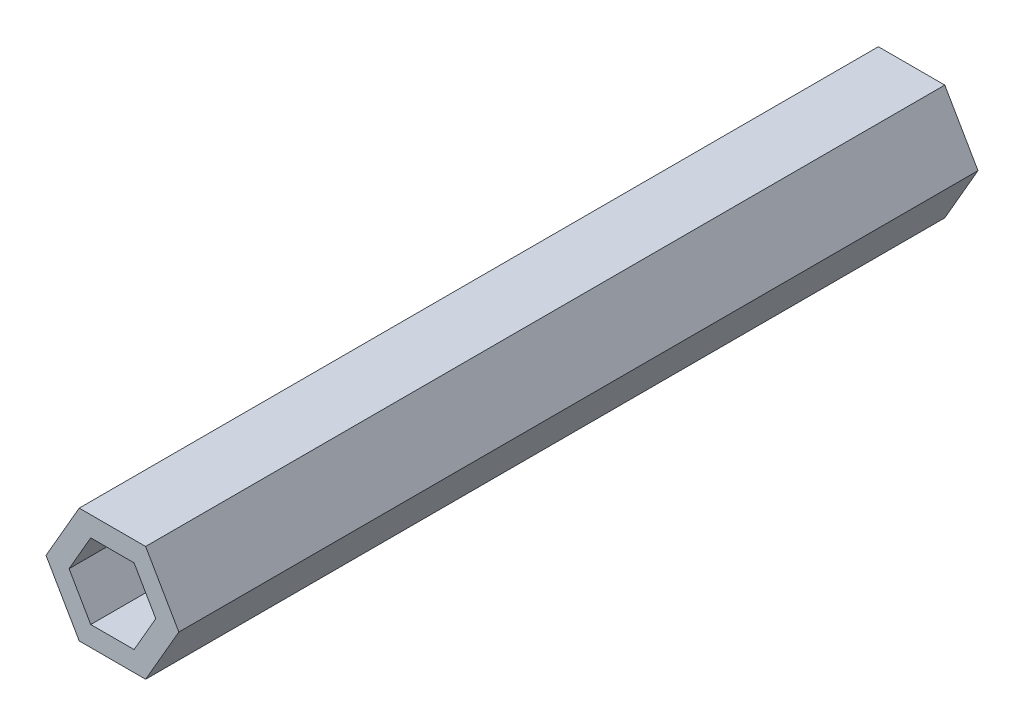
ISO-10303-21;
HEADER;
FILE_DESCRIPTION(('STEP AP214'),'2;1');
FILE_NAME('part.step','',(''),(''),'','','');
FILE_SCHEMA(('AUTOMOTIVE_DESIGN { 1 0 10303 214 1 1 1 1 }'));
ENDSEC;
DATA;
#1=APPLICATION_CONTEXT('core data for automotive mechanical design processes');
#2=APPLICATION_PROTOCOL_DEFINITION('international standard','automotive_design',2000,#1);
#3=PRODUCT_CONTEXT('',#1,'mechanical');
#4=PRODUCT('Part','Part','',(#3));
#5=PRODUCT_RELATED_PRODUCT_CATEGORY('part','',(#4));
#6=PRODUCT_DEFINITION_FORMATION('','',#4);
#7=PRODUCT_DEFINITION_CONTEXT('part definition',#1,'design');
#8=PRODUCT_DEFINITION('design','',#6,#7);
#9=PRODUCT_DEFINITION_SHAPE('','',#8);
#10=(LENGTH_UNIT() NAMED_UNIT(*) SI_UNIT(.MILLI.,.METRE.));
#11=(NAMED_UNIT(*) PLANE_ANGLE_UNIT() SI_UNIT($,.RADIAN.));
#12=(NAMED_UNIT(*) SI_UNIT($,.STERADIAN.) SOLID_ANGLE_UNIT());
#13=UNCERTAINTY_MEASURE_WITH_UNIT(LENGTH_MEASURE(1.E-05),#10,'distance_accuracy_value','');
#14=(GEOMETRIC_REPRESENTATION_CONTEXT(3) GLOBAL_UNCERTAINTY_ASSIGNED_CONTEXT((#13)) GLOBAL_UNIT_ASSIGNED_CONTEXT((#10,
#11,#12)) REPRESENTATION_CONTEXT('',''));
#15=CARTESIAN_POINT('',(0.,0.,0.));
#16=DIRECTION('',(0.,0.,1.));
#17=DIRECTION('',(1.,0.,0.));
#18=AXIS2_PLACEMENT_3D('',#15,#16,#17);
#19=CARTESIAN_POINT('',(0.,0.,101.6));
#20=DIRECTION('',(0.,0.,1.));
#21=DIRECTION('',(1.,0.,0.));
#22=AXIS2_PLACEMENT_3D('',#19,#20,#21);
#23=PLANE('',#22);
#24=DIRECTION('',(-0.5,-0.866025403784439,0.));
#25=VECTOR('',#24,1.);
#26=CARTESIAN_POINT('',(-4.22196621949221,7.31266000000002,101.6));
#27=LINE('',#26,#25);
#28=CARTESIAN_POINT('',(-4.22196621949221,7.31266000000002,101.6));
#29=VERTEX_POINT('',#28);
#30=CARTESIAN_POINT('',(-8.44393243898442,0.,101.6));
#31=VERTEX_POINT('',#30);
#32=EDGE_CURVE('E198',#29,#31,#27,.T.);
#33=ORIENTED_EDGE('',*,*,#32,.T.);
#34=DIRECTION('',(0.5,-0.866025403784439,0.));
#35=VECTOR('',#34,1.);
#36=CARTESIAN_POINT('',(-8.44393243898442,0.,101.6));
#37=LINE('',#36,#35);
#38=CARTESIAN_POINT('',(-4.22196621949221,-7.31266000000001,101.6));
#39=VERTEX_POINT('',#38);
#40=EDGE_CURVE('E202',#31,#39,#37,.T.);
#41=ORIENTED_EDGE('',*,*,#40,.T.);
#42=DIRECTION('',(1.,0.,0.));
#43=VECTOR('',#42,1.);
#44=CARTESIAN_POINT('',(-4.22196621949221,-7.31266000000001,101.6));
#45=LINE('',#44,#43);
#46=CARTESIAN_POINT('',(4.22196621949219,-7.31266000000001,101.6));
#47=VERTEX_POINT('',#46);
#48=EDGE_CURVE('E206',#39,#47,#45,.T.);
#49=ORIENTED_EDGE('',*,*,#48,.T.);
#50=DIRECTION('',(0.5,0.866025403784438,0.));
#51=VECTOR('',#50,1.);
#52=CARTESIAN_POINT('',(4.22196621949219,-7.31266000000001,101.6));
#53=LINE('',#52,#51);
#54=CARTESIAN_POINT('',(8.44393243898441,0.,101.6));
#55=VERTEX_POINT('',#54);
#56=EDGE_CURVE('E209',#47,#55,#53,.T.);
#57=ORIENTED_EDGE('',*,*,#56,.T.);
#58=DIRECTION('',(-0.5,0.866025403784439,0.));
#59=VECTOR('',#58,1.);
#60=CARTESIAN_POINT('',(8.44393243898441,0.,101.6));
#61=LINE('',#60,#59);
#62=CARTESIAN_POINT('',(4.2219662194922,7.31266000000002,101.6));
#63=VERTEX_POINT('',#62);
#64=EDGE_CURVE('E212',#55,#63,#61,.T.);
#65=ORIENTED_EDGE('',*,*,#64,.T.);
#66=DIRECTION('',(-1.,0.,0.));
#67=VECTOR('',#66,1.);
#68=CARTESIAN_POINT('',(4.2219662194922,7.31266000000002,101.6));
#69=LINE('',#68,#67);
#70=EDGE_CURVE('E215',#63,#29,#69,.T.);
#71=ORIENTED_EDGE('',*,*,#70,.T.);
#72=EDGE_LOOP('',(#33,#41,#49,#57,#65,#71));
#73=FACE_BOUND('',#72,.T.);
#74=DIRECTION('',(0.5,-0.866025403784439,0.));
#75=VECTOR('',#74,1.);
#76=CARTESIAN_POINT('',(-5.51099307150112,0.,101.6));
#77=LINE('',#76,#75);
#78=CARTESIAN_POINT('',(-5.51099307150112,0.,101.6));
#79=VERTEX_POINT('',#78);
#80=CARTESIAN_POINT('',(-2.75549653575056,-4.77266000000001,101.6));
#81=VERTEX_POINT('',#80);
#82=EDGE_CURVE('E138',#79,#81,#77,.T.);
#83=ORIENTED_EDGE('',*,*,#82,.F.);
#84=DIRECTION('',(-0.5,-0.866025403784439,0.));
#85=VECTOR('',#84,1.);
#86=CARTESIAN_POINT('',(-2.75549653575056,4.77266000000002,101.6));
#87=LINE('',#86,#85);
#88=CARTESIAN_POINT('',(-2.75549653575056,4.77266000000002,101.6));
#89=VERTEX_POINT('',#88);
#90=EDGE_CURVE('E129',#89,#79,#87,.T.);
#91=ORIENTED_EDGE('',*,*,#90,.F.);
#92=DIRECTION('',(-1.,0.,0.));
#93=VECTOR('',#92,1.);
#94=CARTESIAN_POINT('',(2.75549653575054,4.77266000000002,101.6));
#95=LINE('',#94,#93);
#96=CARTESIAN_POINT('',(2.75549653575054,4.77266000000002,101.6));
#97=VERTEX_POINT('',#96);
#98=EDGE_CURVE('E164',#97,#89,#95,.T.);
#99=ORIENTED_EDGE('',*,*,#98,.F.);
#100=DIRECTION('',(-0.500000000000001,0.866025403784438,0.));
#101=VECTOR('',#100,1.);
#102=CARTESIAN_POINT('',(5.51099307150111,0.,101.6));
#103=LINE('',#102,#101);
#104=CARTESIAN_POINT('',(5.51099307150111,0.,101.6));
#105=VERTEX_POINT('',#104);
#106=EDGE_CURVE('E161',#105,#97,#103,.T.);
#107=ORIENTED_EDGE('',*,*,#106,.F.);
#108=DIRECTION('',(0.5,0.866025403784439,0.));
#109=VECTOR('',#108,1.);
#110=CARTESIAN_POINT('',(2.75549653575054,-4.77266000000001,101.6));
#111=LINE('',#110,#109);
#112=CARTESIAN_POINT('',(2.75549653575054,-4.77266000000001,101.6));
#113=VERTEX_POINT('',#112);
#114=EDGE_CURVE('E156',#113,#105,#111,.T.);
#115=ORIENTED_EDGE('',*,*,#114,.F.);
#116=DIRECTION('',(1.,0.,0.));
#117=VECTOR('',#116,1.);
#118=CARTESIAN_POINT('',(-2.75549653575056,-4.77266000000001,101.6));
#119=LINE('',#118,#117);
#120=EDGE_CURVE('E152',#81,#113,#119,.T.);
#121=ORIENTED_EDGE('',*,*,#120,.F.);
#122=EDGE_LOOP('',(#83,#91,#99,#107,#115,#121));
#123=FACE_BOUND('',#122,.T.);
#124=ADVANCED_FACE('F39',(#73,#123),#23,.T.);
#125=CARTESIAN_POINT('',(0.,0.,0.));
#126=DIRECTION('',(0.,0.,1.));
#127=DIRECTION('',(1.,0.,0.));
#128=AXIS2_PLACEMENT_3D('',#125,#126,#127);
#129=PLANE('',#128);
#130=DIRECTION('',(-0.5,-0.866025403784439,0.));
#131=VECTOR('',#130,1.);
#132=CARTESIAN_POINT('',(-4.22196621949221,7.31266000000002,0.));
#133=LINE('',#132,#131);
#134=CARTESIAN_POINT('',(-4.22196621949221,7.31266000000002,0.));
#135=VERTEX_POINT('',#134);
#136=CARTESIAN_POINT('',(-8.44393243898442,0.,0.));
#137=VERTEX_POINT('',#136);
#138=EDGE_CURVE('E147',#135,#137,#133,.T.);
#139=ORIENTED_EDGE('',*,*,#138,.F.);
#140=DIRECTION('',(-1.,0.,0.));
#141=VECTOR('',#140,1.);
#142=CARTESIAN_POINT('',(4.2219662194922,7.31266000000002,0.));
#143=LINE('',#142,#141);
#144=CARTESIAN_POINT('',(4.2219662194922,7.31266000000002,0.));
#145=VERTEX_POINT('',#144);
#146=EDGE_CURVE('E203',#145,#135,#143,.T.);
#147=ORIENTED_EDGE('',*,*,#146,.F.);
#148=DIRECTION('',(-0.5,0.866025403784439,0.));
#149=VECTOR('',#148,1.);
#150=CARTESIAN_POINT('',(8.44393243898441,0.,0.));
#151=LINE('',#150,#149);
#152=CARTESIAN_POINT('',(8.44393243898441,0.,0.));
#153=VERTEX_POINT('',#152);
#154=EDGE_CURVE('E231',#153,#145,#151,.T.);
#155=ORIENTED_EDGE('',*,*,#154,.F.);
#156=DIRECTION('',(0.5,0.866025403784438,0.));
#157=VECTOR('',#156,1.);
#158=CARTESIAN_POINT('',(4.22196621949219,-7.31266000000001,0.));
#159=LINE('',#158,#157);
#160=CARTESIAN_POINT('',(4.22196621949219,-7.31266000000001,0.));
#161=VERTEX_POINT('',#160);
#162=EDGE_CURVE('E228',#161,#153,#159,.T.);
#163=ORIENTED_EDGE('',*,*,#162,.F.);
#164=DIRECTION('',(1.,0.,0.));
#165=VECTOR('',#164,1.);
#166=CARTESIAN_POINT('',(-4.22196621949221,-7.31266000000001,0.));
#167=LINE('',#166,#165);
#168=CARTESIAN_POINT('',(-4.22196621949221,-7.31266000000001,0.));
#169=VERTEX_POINT('',#168);
#170=EDGE_CURVE('E225',#169,#161,#167,.T.);
#171=ORIENTED_EDGE('',*,*,#170,.F.);
#172=DIRECTION('',(0.5,-0.866025403784439,0.));
#173=VECTOR('',#172,1.);
#174=CARTESIAN_POINT('',(-8.44393243898442,0.,0.));
#175=LINE('',#174,#173);
#176=EDGE_CURVE('E222',#137,#169,#175,.T.);
#177=ORIENTED_EDGE('',*,*,#176,.F.);
#178=EDGE_LOOP('',(#139,#147,#155,#163,#171,#177));
#179=FACE_BOUND('',#178,.T.);
#180=DIRECTION('',(-0.5,-0.866025403784439,0.));
#181=VECTOR('',#180,1.);
#182=CARTESIAN_POINT('',(-2.75549653575056,4.77266000000002,0.));
#183=LINE('',#182,#181);
#184=CARTESIAN_POINT('',(-2.75549653575056,4.77266000000002,0.));
#185=VERTEX_POINT('',#184);
#186=CARTESIAN_POINT('',(-5.51099307150112,0.,0.));
#187=VERTEX_POINT('',#186);
#188=EDGE_CURVE('E63',#185,#187,#183,.T.);
#189=ORIENTED_EDGE('',*,*,#188,.T.);
#190=DIRECTION('',(0.5,-0.866025403784439,0.));
#191=VECTOR('',#190,1.);
#192=CARTESIAN_POINT('',(-5.51099307150112,0.,0.));
#193=LINE('',#192,#191);
#194=CARTESIAN_POINT('',(-2.75549653575056,-4.77266000000001,0.));
#195=VERTEX_POINT('',#194);
#196=EDGE_CURVE('E145',#187,#195,#193,.T.);
#197=ORIENTED_EDGE('',*,*,#196,.T.);
#198=DIRECTION('',(1.,0.,0.));
#199=VECTOR('',#198,1.);
#200=CARTESIAN_POINT('',(-2.75549653575056,-4.77266000000001,0.));
#201=LINE('',#200,#199);
#202=CARTESIAN_POINT('',(2.75549653575054,-4.77266000000001,0.));
#203=VERTEX_POINT('',#202);
#204=EDGE_CURVE('E171',#195,#203,#201,.T.);
#205=ORIENTED_EDGE('',*,*,#204,.T.);
#206=DIRECTION('',(0.5,0.866025403784439,0.));
#207=VECTOR('',#206,1.);
#208=CARTESIAN_POINT('',(2.75549653575054,-4.77266000000001,0.));
#209=LINE('',#208,#207);
#210=CARTESIAN_POINT('',(5.51099307150111,0.,0.));
#211=VERTEX_POINT('',#210);
#212=EDGE_CURVE('E175',#203,#211,#209,.T.);
#213=ORIENTED_EDGE('',*,*,#212,.T.);
#214=DIRECTION('',(-0.500000000000001,0.866025403784438,0.));
#215=VECTOR('',#214,1.);
#216=CARTESIAN_POINT('',(5.51099307150111,0.,0.));
#217=LINE('',#216,#215);
#218=CARTESIAN_POINT('',(2.75549653575054,4.77266000000002,0.));
#219=VERTEX_POINT('',#218);
#220=EDGE_CURVE('E179',#211,#219,#217,.T.);
#221=ORIENTED_EDGE('',*,*,#220,.T.);
#222=DIRECTION('',(-1.,0.,0.));
#223=VECTOR('',#222,1.);
#224=CARTESIAN_POINT('',(2.75549653575054,4.77266000000002,0.));
#225=LINE('',#224,#223);
#226=EDGE_CURVE('E139',#219,#185,#225,.T.);
#227=ORIENTED_EDGE('',*,*,#226,.T.);
#228=EDGE_LOOP('',(#189,#197,#205,#213,#221,#227));
#229=FACE_BOUND('',#228,.T.);
#230=ADVANCED_FACE('F262',(#179,#229),#129,.F.);
#231=CARTESIAN_POINT('',(-4.22196621949221,7.31266000000002,101.6));
#232=DIRECTION('',(0.866025403784439,-0.5,0.));
#233=DIRECTION('',(0.5,0.866025403784439,0.));
#234=AXIS2_PLACEMENT_3D('',#231,#232,#233);
#235=PLANE('',#234);
#236=ORIENTED_EDGE('',*,*,#138,.T.);
#237=DIRECTION('',(0.,0.,-1.));
#238=VECTOR('',#237,1.);
#239=CARTESIAN_POINT('',(-8.44393243898442,0.,101.6));
#240=LINE('',#239,#238);
#241=EDGE_CURVE('E11',#31,#137,#240,.T.);
#242=ORIENTED_EDGE('',*,*,#241,.F.);
#243=ORIENTED_EDGE('',*,*,#32,.F.);
#244=DIRECTION('',(0.,0.,-1.));
#245=VECTOR('',#244,1.);
#246=CARTESIAN_POINT('',(-4.22196621949221,7.31266000000002,101.6));
#247=LINE('',#246,#245);
#248=EDGE_CURVE('E218',#29,#135,#247,.T.);
#249=ORIENTED_EDGE('',*,*,#248,.T.);
#250=EDGE_LOOP('',(#236,#242,#243,#249));
#251=FACE_BOUND('',#250,.T.);
#252=ADVANCED_FACE('F41',(#251),#235,.F.);
#253=CARTESIAN_POINT('',(-8.44393243898442,0.,101.6));
#254=DIRECTION('',(0.866025403784439,0.5,0.));
#255=DIRECTION('',(-0.5,0.866025403784439,0.));
#256=AXIS2_PLACEMENT_3D('',#253,#254,#255);
#257=PLANE('',#256);
#258=ORIENTED_EDGE('',*,*,#176,.T.);
#259=DIRECTION('',(0.,0.,-1.));
#260=VECTOR('',#259,1.);
#261=CARTESIAN_POINT('',(-4.22196621949221,-7.31266000000001,101.6));
#262=LINE('',#261,#260);
#263=EDGE_CURVE('E48',#39,#169,#262,.T.);
#264=ORIENTED_EDGE('',*,*,#263,.F.);
#265=ORIENTED_EDGE('',*,*,#40,.F.);
#266=ORIENTED_EDGE('',*,*,#241,.T.);
#267=EDGE_LOOP('',(#258,#264,#265,#266));
#268=FACE_BOUND('',#267,.T.);
#269=ADVANCED_FACE('F279',(#268),#257,.F.);
#270=CARTESIAN_POINT('',(-4.22196621949221,-7.31266000000001,101.6));
#271=DIRECTION('',(0.,1.,0.));
#272=DIRECTION('',(0.,0.,1.));
#273=AXIS2_PLACEMENT_3D('',#270,#271,#272);
#274=PLANE('',#273);
#275=ORIENTED_EDGE('',*,*,#170,.T.);
#276=DIRECTION('',(0.,0.,-1.));
#277=VECTOR('',#276,1.);
#278=CARTESIAN_POINT('',(4.22196621949219,-7.31266000000001,101.6));
#279=LINE('',#278,#277);
#280=EDGE_CURVE('E247',#47,#161,#279,.T.);
#281=ORIENTED_EDGE('',*,*,#280,.F.);
#282=ORIENTED_EDGE('',*,*,#48,.F.);
#283=ORIENTED_EDGE('',*,*,#263,.T.);
#284=EDGE_LOOP('',(#275,#281,#282,#283));
#285=FACE_BOUND('',#284,.T.);
#286=ADVANCED_FACE('F256',(#285),#274,.F.);
#287=CARTESIAN_POINT('',(4.22196621949219,-7.31266000000001,101.6));
#288=DIRECTION('',(-0.866025403784438,0.5,0.));
#289=DIRECTION('',(-0.5,-0.866025403784439,0.));
#290=AXIS2_PLACEMENT_3D('',#287,#288,#289);
#291=PLANE('',#290);
#292=ORIENTED_EDGE('',*,*,#162,.T.);
#293=DIRECTION('',(0.,0.,-1.));
#294=VECTOR('',#293,1.);
#295=CARTESIAN_POINT('',(8.44393243898441,0.,101.6));
#296=LINE('',#295,#294);
#297=EDGE_CURVE('E243',#55,#153,#296,.T.);
#298=ORIENTED_EDGE('',*,*,#297,.F.);
#299=ORIENTED_EDGE('',*,*,#56,.F.);
#300=ORIENTED_EDGE('',*,*,#280,.T.);
#301=EDGE_LOOP('',(#292,#298,#299,#300));
#302=FACE_BOUND('',#301,.T.);
#303=ADVANCED_FACE('F268',(#302),#291,.F.);
#304=CARTESIAN_POINT('',(8.44393243898441,0.,101.6));
#305=DIRECTION('',(-0.866025403784439,-0.5,0.));
#306=DIRECTION('',(0.5,-0.866025403784439,0.));
#307=AXIS2_PLACEMENT_3D('',#304,#305,#306);
#308=PLANE('',#307);
#309=ORIENTED_EDGE('',*,*,#154,.T.);
#310=DIRECTION('',(0.,0.,-1.));
#311=VECTOR('',#310,1.);
#312=CARTESIAN_POINT('',(4.2219662194922,7.31266000000002,101.6));
#313=LINE('',#312,#311);
#314=EDGE_CURVE('E239',#63,#145,#313,.T.);
#315=ORIENTED_EDGE('',*,*,#314,.F.);
#316=ORIENTED_EDGE('',*,*,#64,.F.);
#317=ORIENTED_EDGE('',*,*,#297,.T.);
#318=EDGE_LOOP('',(#309,#315,#316,#317));
#319=FACE_BOUND('',#318,.T.);
#320=ADVANCED_FACE('F272',(#319),#308,.F.);
#321=CARTESIAN_POINT('',(4.2219662194922,7.31266000000002,101.6));
#322=DIRECTION('',(0.,-1.,0.));
#323=DIRECTION('',(0.,0.,-1.));
#324=AXIS2_PLACEMENT_3D('',#321,#322,#323);
#325=PLANE('',#324);
#326=ORIENTED_EDGE('',*,*,#146,.T.);
#327=ORIENTED_EDGE('',*,*,#248,.F.);
#328=ORIENTED_EDGE('',*,*,#70,.F.);
#329=ORIENTED_EDGE('',*,*,#314,.T.);
#330=EDGE_LOOP('',(#326,#327,#328,#329));
#331=FACE_BOUND('',#330,.T.);
#332=ADVANCED_FACE('F282',(#331),#325,.F.);
#333=CARTESIAN_POINT('',(-2.75549653575056,4.77266000000002,101.6));
#334=DIRECTION('',(0.866025403784439,-0.5,0.));
#335=DIRECTION('',(0.5,0.866025403784439,0.));
#336=AXIS2_PLACEMENT_3D('',#333,#334,#335);
#337=PLANE('',#336);
#338=ORIENTED_EDGE('',*,*,#188,.F.);
#339=DIRECTION('',(0.,0.,-1.));
#340=VECTOR('',#339,1.);
#341=CARTESIAN_POINT('',(-2.75549653575056,4.77266000000002,101.6));
#342=LINE('',#341,#340);
#343=EDGE_CURVE('E133',#89,#185,#342,.T.);
#344=ORIENTED_EDGE('',*,*,#343,.F.);
#345=ORIENTED_EDGE('',*,*,#90,.T.);
#346=DIRECTION('',(0.,0.,-1.));
#347=VECTOR('',#346,1.);
#348=CARTESIAN_POINT('',(-5.51099307150112,0.,101.6));
#349=LINE('',#348,#347);
#350=EDGE_CURVE('E132',#79,#187,#349,.T.);
#351=ORIENTED_EDGE('',*,*,#350,.T.);
#352=EDGE_LOOP('',(#338,#344,#345,#351));
#353=FACE_BOUND('',#352,.T.);
#354=ADVANCED_FACE('F131',(#353),#337,.T.);
#355=CARTESIAN_POINT('',(-5.51099307150112,0.,101.6));
#356=DIRECTION('',(0.866025403784439,0.5,0.));
#357=DIRECTION('',(-0.5,0.866025403784439,0.));
#358=AXIS2_PLACEMENT_3D('',#355,#356,#357);
#359=PLANE('',#358);
#360=ORIENTED_EDGE('',*,*,#196,.F.);
#361=ORIENTED_EDGE('',*,*,#350,.F.);
#362=ORIENTED_EDGE('',*,*,#82,.T.);
#363=DIRECTION('',(0.,0.,-1.));
#364=VECTOR('',#363,1.);
#365=CARTESIAN_POINT('',(-2.75549653575056,-4.77266000000001,101.6));
#366=LINE('',#365,#364);
#367=EDGE_CURVE('E148',#81,#195,#366,.T.);
#368=ORIENTED_EDGE('',*,*,#367,.T.);
#369=EDGE_LOOP('',(#360,#361,#362,#368));
#370=FACE_BOUND('',#369,.T.);
#371=ADVANCED_FACE('F142',(#370),#359,.T.);
#372=CARTESIAN_POINT('',(-2.75549653575056,-4.77266000000001,101.6));
#373=DIRECTION('',(0.,1.,0.));
#374=DIRECTION('',(0.,0.,1.));
#375=AXIS2_PLACEMENT_3D('',#372,#373,#374);
#376=PLANE('',#375);
#377=ORIENTED_EDGE('',*,*,#204,.F.);
#378=ORIENTED_EDGE('',*,*,#367,.F.);
#379=ORIENTED_EDGE('',*,*,#120,.T.);
#380=DIRECTION('',(0.,0.,-1.));
#381=VECTOR('',#380,1.);
#382=CARTESIAN_POINT('',(2.75549653575054,-4.77266000000001,101.6));
#383=LINE('',#382,#381);
#384=EDGE_CURVE('E193',#113,#203,#383,.T.);
#385=ORIENTED_EDGE('',*,*,#384,.T.);
#386=EDGE_LOOP('',(#377,#378,#379,#385));
#387=FACE_BOUND('',#386,.T.);
#388=ADVANCED_FACE('F300',(#387),#376,.T.);
#389=CARTESIAN_POINT('',(2.75549653575054,-4.77266000000001,101.6));
#390=DIRECTION('',(-0.866025403784439,0.5,0.));
#391=DIRECTION('',(-0.5,-0.866025403784439,0.));
#392=AXIS2_PLACEMENT_3D('',#389,#390,#391);
#393=PLANE('',#392);
#394=ORIENTED_EDGE('',*,*,#212,.F.);
#395=ORIENTED_EDGE('',*,*,#384,.F.);
#396=ORIENTED_EDGE('',*,*,#114,.T.);
#397=DIRECTION('',(0.,0.,-1.));
#398=VECTOR('',#397,1.);
#399=CARTESIAN_POINT('',(5.51099307150111,0.,101.6));
#400=LINE('',#399,#398);
#401=EDGE_CURVE('E190',#105,#211,#400,.T.);
#402=ORIENTED_EDGE('',*,*,#401,.T.);
#403=EDGE_LOOP('',(#394,#395,#396,#402));
#404=FACE_BOUND('',#403,.T.);
#405=ADVANCED_FACE('F303',(#404),#393,.T.);
#406=CARTESIAN_POINT('',(5.51099307150111,0.,101.6));
#407=DIRECTION('',(-0.866025403784438,-0.500000000000001,0.));
#408=DIRECTION('',(0.500000000000001,-0.866025403784438,0.));
#409=AXIS2_PLACEMENT_3D('',#406,#407,#408);
#410=PLANE('',#409);
#411=ORIENTED_EDGE('',*,*,#220,.F.);
#412=ORIENTED_EDGE('',*,*,#401,.F.);
#413=ORIENTED_EDGE('',*,*,#106,.T.);
#414=DIRECTION('',(0.,0.,-1.));
#415=VECTOR('',#414,1.);
#416=CARTESIAN_POINT('',(2.75549653575054,4.77266000000002,101.6));
#417=LINE('',#416,#415);
#418=EDGE_CURVE('E55',#97,#219,#417,.T.);
#419=ORIENTED_EDGE('',*,*,#418,.T.);
#420=EDGE_LOOP('',(#411,#412,#413,#419));
#421=FACE_BOUND('',#420,.T.);
#422=ADVANCED_FACE('F307',(#421),#410,.T.);
#423=CARTESIAN_POINT('',(2.75549653575054,4.77266000000002,101.6));
#424=DIRECTION('',(0.,-1.,0.));
#425=DIRECTION('',(0.,0.,-1.));
#426=AXIS2_PLACEMENT_3D('',#423,#424,#425);
#427=PLANE('',#426);
#428=ORIENTED_EDGE('',*,*,#226,.F.);
#429=ORIENTED_EDGE('',*,*,#418,.F.);
#430=ORIENTED_EDGE('',*,*,#98,.T.);
#431=ORIENTED_EDGE('',*,*,#343,.T.);
#432=EDGE_LOOP('',(#428,#429,#430,#431));
#433=FACE_BOUND('',#432,.T.);
#434=ADVANCED_FACE('F311',(#433),#427,.T.);
#435=CLOSED_SHELL('',(#124,#230,#252,#269,#286,#303,#320,#332,#354,#371,#388,#405,#422,#434));
#436=MANIFOLD_SOLID_BREP('B2',#435);
#437=ADVANCED_BREP_SHAPE_REPRESENTATION('',(#18,#436),#14);
#438=SHAPE_DEFINITION_REPRESENTATION(#9,#437);
ENDSEC;
END-ISO-10303-21;
